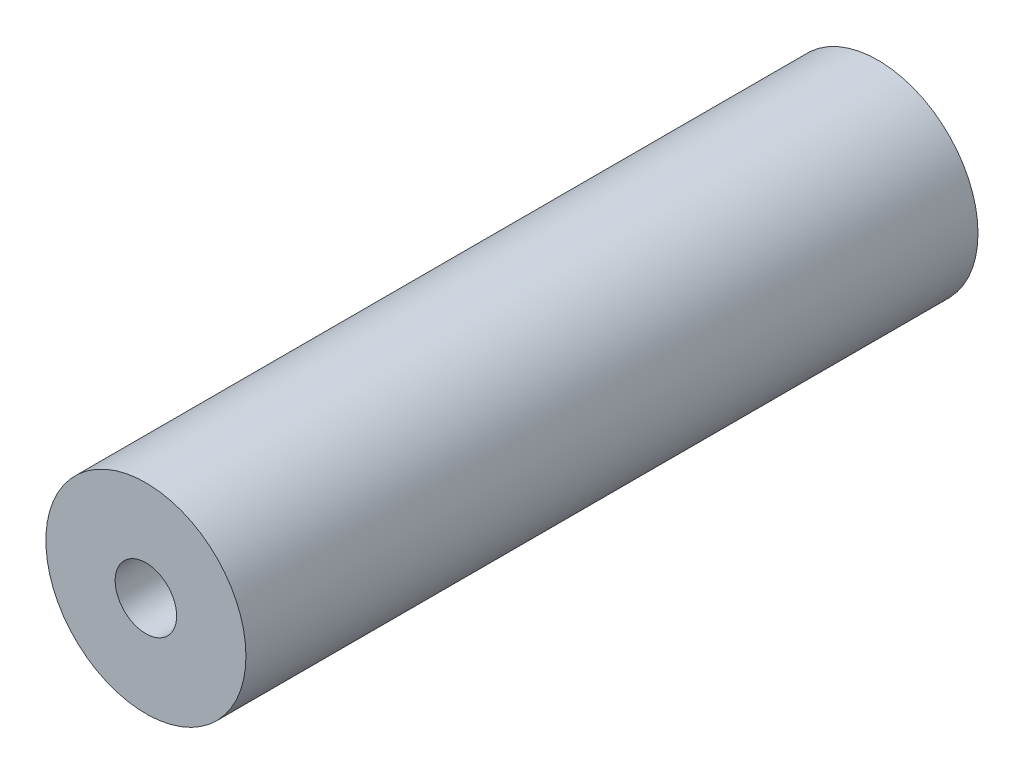
ISO-10303-21;
HEADER;
FILE_DESCRIPTION(('STEP AP214'),'2;1');
FILE_NAME('part.step','',(''),(''),'','','');
FILE_SCHEMA(('AUTOMOTIVE_DESIGN { 1 0 10303 214 1 1 1 1 }'));
ENDSEC;
DATA;
#1=APPLICATION_CONTEXT('core data for automotive mechanical design processes');
#2=APPLICATION_PROTOCOL_DEFINITION('international standard','automotive_design',2000,#1);
#3=PRODUCT_CONTEXT('',#1,'mechanical');
#4=PRODUCT('Part','Part','',(#3));
#5=PRODUCT_RELATED_PRODUCT_CATEGORY('part','',(#4));
#6=PRODUCT_DEFINITION_FORMATION('','',#4);
#7=PRODUCT_DEFINITION_CONTEXT('part definition',#1,'design');
#8=PRODUCT_DEFINITION('design','',#6,#7);
#9=PRODUCT_DEFINITION_SHAPE('','',#8);
#10=(LENGTH_UNIT() NAMED_UNIT(*) SI_UNIT(.MILLI.,.METRE.));
#11=(NAMED_UNIT(*) PLANE_ANGLE_UNIT() SI_UNIT($,.RADIAN.));
#12=(NAMED_UNIT(*) SI_UNIT($,.STERADIAN.) SOLID_ANGLE_UNIT());
#13=UNCERTAINTY_MEASURE_WITH_UNIT(LENGTH_MEASURE(1.E-05),#10,'distance_accuracy_value','');
#14=(GEOMETRIC_REPRESENTATION_CONTEXT(3) GLOBAL_UNCERTAINTY_ASSIGNED_CONTEXT((#13)) GLOBAL_UNIT_ASSIGNED_CONTEXT((#10,
#11,#12)) REPRESENTATION_CONTEXT('',''));
#15=CARTESIAN_POINT('',(0.,0.,0.));
#16=DIRECTION('',(0.,0.,1.));
#17=DIRECTION('',(1.,0.,0.));
#18=AXIS2_PLACEMENT_3D('',#15,#16,#17);
#19=CARTESIAN_POINT('',(0.,0.,15.));
#20=DIRECTION('',(0.,0.,1.));
#21=DIRECTION('',(1.,0.,0.));
#22=AXIS2_PLACEMENT_3D('',#19,#20,#21);
#23=PLANE('',#22);
#24=CARTESIAN_POINT('',(0.,0.,15.));
#25=DIRECTION('',(0.,0.,1.));
#26=DIRECTION('',(1.,0.,0.));
#27=AXIS2_PLACEMENT_3D('',#24,#25,#26);
#28=CIRCLE('',#27,2.05);
#29=CARTESIAN_POINT('',(2.05,0.,15.));
#30=VERTEX_POINT('',#29);
#31=EDGE_CURVE('E10',#30,#30,#28,.T.);
#32=ORIENTED_EDGE('',*,*,#31,.T.);
#33=EDGE_LOOP('',(#32));
#34=FACE_BOUND('',#33,.T.);
#35=CARTESIAN_POINT('',(0.,0.,15.));
#36=DIRECTION('',(0.,0.,1.));
#37=DIRECTION('',(1.,0.,0.));
#38=AXIS2_PLACEMENT_3D('',#35,#36,#37);
#39=CIRCLE('',#38,0.63);
#40=CARTESIAN_POINT('',(0.63,0.,15.));
#41=VERTEX_POINT('',#40);
#42=EDGE_CURVE('E42',#41,#41,#39,.T.);
#43=ORIENTED_EDGE('',*,*,#42,.F.);
#44=EDGE_LOOP('',(#43));
#45=FACE_BOUND('',#44,.T.);
#46=ADVANCED_FACE('F31',(#34,#45),#23,.T.);
#47=CARTESIAN_POINT('',(0.,0.,0.));
#48=DIRECTION('',(0.,0.,1.));
#49=DIRECTION('',(1.,0.,0.));
#50=AXIS2_PLACEMENT_3D('',#47,#48,#49);
#51=PLANE('',#50);
#52=CARTESIAN_POINT('',(0.,0.,0.));
#53=DIRECTION('',(0.,0.,1.));
#54=DIRECTION('',(1.,0.,0.));
#55=AXIS2_PLACEMENT_3D('',#52,#53,#54);
#56=CIRCLE('',#55,2.05);
#57=CARTESIAN_POINT('',(2.05,0.,0.));
#58=VERTEX_POINT('',#57);
#59=EDGE_CURVE('E35',#58,#58,#56,.T.);
#60=ORIENTED_EDGE('',*,*,#59,.F.);
#61=EDGE_LOOP('',(#60));
#62=FACE_BOUND('',#61,.T.);
#63=CARTESIAN_POINT('',(0.,0.,0.));
#64=DIRECTION('',(0.,0.,1.));
#65=DIRECTION('',(1.,0.,0.));
#66=AXIS2_PLACEMENT_3D('',#63,#64,#65);
#67=CIRCLE('',#66,0.63);
#68=CARTESIAN_POINT('',(0.63,0.,0.));
#69=VERTEX_POINT('',#68);
#70=EDGE_CURVE('E44',#69,#69,#67,.T.);
#71=ORIENTED_EDGE('',*,*,#70,.T.);
#72=EDGE_LOOP('',(#71));
#73=FACE_BOUND('',#72,.T.);
#74=ADVANCED_FACE('F54',(#62,#73),#51,.F.);
#75=CARTESIAN_POINT('',(0.,0.,15.));
#76=DIRECTION('',(0.,0.,-1.));
#77=DIRECTION('',(-1.,0.,0.));
#78=AXIS2_PLACEMENT_3D('',#75,#76,#77);
#79=CYLINDRICAL_SURFACE('',#78,2.05);
#80=ORIENTED_EDGE('',*,*,#31,.F.);
#81=EDGE_LOOP('',(#80));
#82=FACE_BOUND('',#81,.T.);
#83=ORIENTED_EDGE('',*,*,#59,.T.);
#84=EDGE_LOOP('',(#83));
#85=FACE_BOUND('',#84,.T.);
#86=ADVANCED_FACE('F33',(#82,#85),#79,.T.);
#87=CARTESIAN_POINT('',(0.,0.,15.));
#88=DIRECTION('',(0.,0.,-1.));
#89=DIRECTION('',(-1.,0.,0.));
#90=AXIS2_PLACEMENT_3D('',#87,#88,#89);
#91=CYLINDRICAL_SURFACE('',#90,0.63);
#92=ORIENTED_EDGE('',*,*,#42,.T.);
#93=EDGE_LOOP('',(#92));
#94=FACE_BOUND('',#93,.T.);
#95=ORIENTED_EDGE('',*,*,#70,.F.);
#96=EDGE_LOOP('',(#95));
#97=FACE_BOUND('',#96,.T.);
#98=ADVANCED_FACE('F50',(#94,#97),#91,.F.);
#99=CLOSED_SHELL('',(#46,#74,#86,#98));
#100=MANIFOLD_SOLID_BREP('B2',#99);
#101=ADVANCED_BREP_SHAPE_REPRESENTATION('',(#18,#100),#14);
#102=SHAPE_DEFINITION_REPRESENTATION(#9,#101);
ENDSEC;
END-ISO-10303-21;
